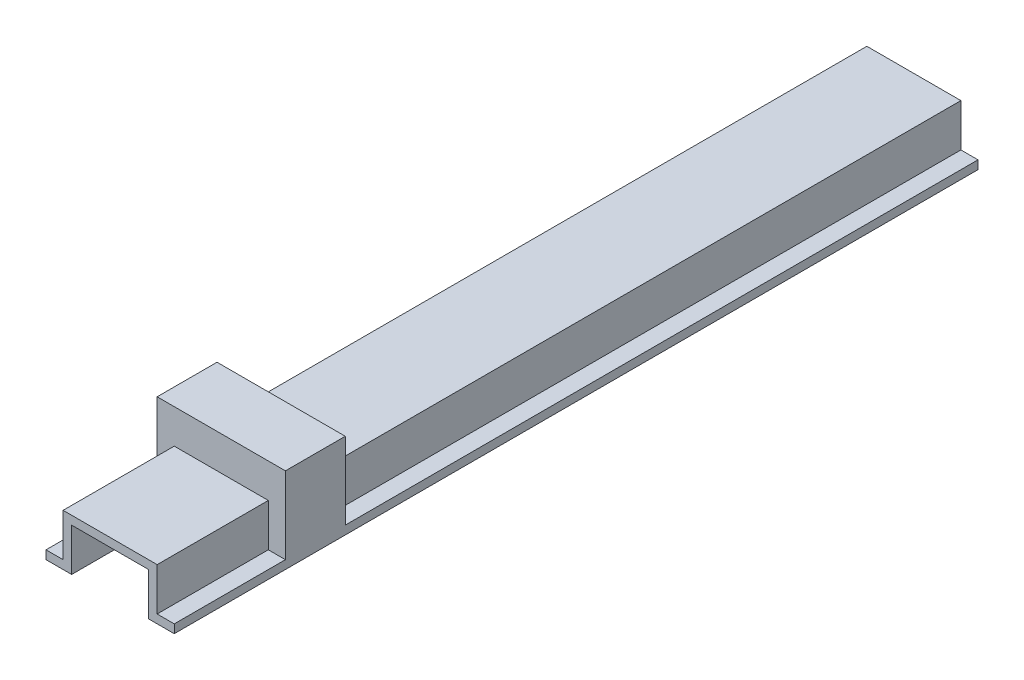
ISO-10303-21;
HEADER;
FILE_DESCRIPTION(('STEP AP214'),'2;1');
FILE_NAME('part.step','',(''),(''),'','','');
FILE_SCHEMA(('AUTOMOTIVE_DESIGN { 1 0 10303 214 1 1 1 1 }'));
ENDSEC;
DATA;
#1=APPLICATION_CONTEXT('core data for automotive mechanical design processes');
#2=APPLICATION_PROTOCOL_DEFINITION('international standard','automotive_design',2000,#1);
#3=PRODUCT_CONTEXT('',#1,'mechanical');
#4=PRODUCT('Part','Part','',(#3));
#5=PRODUCT_RELATED_PRODUCT_CATEGORY('part','',(#4));
#6=PRODUCT_DEFINITION_FORMATION('','',#4);
#7=PRODUCT_DEFINITION_CONTEXT('part definition',#1,'design');
#8=PRODUCT_DEFINITION('design','',#6,#7);
#9=PRODUCT_DEFINITION_SHAPE('','',#8);
#10=(LENGTH_UNIT() NAMED_UNIT(*) SI_UNIT(.MILLI.,.METRE.));
#11=(NAMED_UNIT(*) PLANE_ANGLE_UNIT() SI_UNIT($,.RADIAN.));
#12=(NAMED_UNIT(*) SI_UNIT($,.STERADIAN.) SOLID_ANGLE_UNIT());
#13=UNCERTAINTY_MEASURE_WITH_UNIT(LENGTH_MEASURE(1.E-05),#10,'distance_accuracy_value','');
#14=(GEOMETRIC_REPRESENTATION_CONTEXT(3) GLOBAL_UNCERTAINTY_ASSIGNED_CONTEXT((#13)) GLOBAL_UNIT_ASSIGNED_CONTEXT((#10,
#11,#12)) REPRESENTATION_CONTEXT('',''));
#15=CARTESIAN_POINT('',(0.,0.,0.));
#16=DIRECTION('',(0.,0.,1.));
#17=DIRECTION('',(1.,0.,0.));
#18=AXIS2_PLACEMENT_3D('',#15,#16,#17);
#19=CARTESIAN_POINT('',(-4.36598484476296,1.814,94.));
#20=DIRECTION('',(0.,1.,0.));
#21=DIRECTION('',(-1.,0.,0.));
#22=AXIS2_PLACEMENT_3D('',#19,#20,#21);
#23=PLANE('',#22);
#24=DIRECTION('',(0.,0.,-1.));
#25=VECTOR('',#24,1.);
#26=CARTESIAN_POINT('',(4.63401515523704,1.814,94.));
#27=LINE('',#26,#25);
#28=CARTESIAN_POINT('',(4.63401515523704,1.814,75.));
#29=VERTEX_POINT('',#28);
#30=CARTESIAN_POINT('',(4.63401515523704,1.814,0.));
#31=VERTEX_POINT('',#30);
#32=EDGE_CURVE('E320',#29,#31,#27,.T.);
#33=ORIENTED_EDGE('',*,*,#32,.F.);
#34=DIRECTION('',(-1.,0.,0.));
#35=VECTOR('',#34,1.);
#36=CARTESIAN_POINT('',(-4.36598484476296,1.814,75.));
#37=LINE('',#36,#35);
#38=CARTESIAN_POINT('',(-4.36598484476296,1.814,75.));
#39=VERTEX_POINT('',#38);
#40=EDGE_CURVE('E250',#29,#39,#37,.T.);
#41=ORIENTED_EDGE('',*,*,#40,.T.);
#42=DIRECTION('',(0.,0.,-1.));
#43=VECTOR('',#42,1.);
#44=CARTESIAN_POINT('',(-4.36598484476296,1.814,94.));
#45=LINE('',#44,#43);
#46=CARTESIAN_POINT('',(-4.36598484476296,1.814,0.));
#47=VERTEX_POINT('',#46);
#48=EDGE_CURVE('E353',#39,#47,#45,.T.);
#49=ORIENTED_EDGE('',*,*,#48,.T.);
#50=DIRECTION('',(1.,0.,0.));
#51=VECTOR('',#50,1.);
#52=CARTESIAN_POINT('',(-4.36598484476296,1.814,0.));
#53=LINE('',#52,#51);
#54=EDGE_CURVE('E348',#47,#31,#53,.T.);
#55=ORIENTED_EDGE('',*,*,#54,.T.);
#56=EDGE_LOOP('',(#33,#41,#49,#55));
#57=FACE_BOUND('',#56,.T.);
#58=ADVANCED_FACE('F33',(#57),#23,.F.);
#59=CARTESIAN_POINT('',(7.63401515523704,-2.186,94.));
#60=DIRECTION('',(0.,-1.,0.));
#61=DIRECTION('',(1.,0.,0.));
#62=AXIS2_PLACEMENT_3D('',#59,#60,#61);
#63=PLANE('',#62);
#64=DIRECTION('',(-1.,0.,0.));
#65=VECTOR('',#64,1.);
#66=CARTESIAN_POINT('',(-7.36598484476295,-2.186,74.));
#67=LINE('',#66,#65);
#68=CARTESIAN_POINT('',(7.63401515523705,-2.18599999999999,74.));
#69=VERTEX_POINT('',#68);
#70=CARTESIAN_POINT('',(5.63401515523704,-2.18599999999999,74.));
#71=VERTEX_POINT('',#70);
#72=EDGE_CURVE('E268',#69,#71,#67,.T.);
#73=ORIENTED_EDGE('',*,*,#72,.F.);
#74=DIRECTION('',(0.,0.,-1.));
#75=VECTOR('',#74,1.);
#76=CARTESIAN_POINT('',(7.63401515523704,-2.186,94.));
#77=LINE('',#76,#75);
#78=CARTESIAN_POINT('',(7.63401515523704,-2.186,0.));
#79=VERTEX_POINT('',#78);
#80=EDGE_CURVE('E383',#69,#79,#77,.T.);
#81=ORIENTED_EDGE('',*,*,#80,.T.);
#82=DIRECTION('',(-1.,0.,0.));
#83=VECTOR('',#82,1.);
#84=CARTESIAN_POINT('',(7.63401515523704,-2.186,0.));
#85=LINE('',#84,#83);
#86=CARTESIAN_POINT('',(5.63401515523704,-2.186,0.));
#87=VERTEX_POINT('',#86);
#88=EDGE_CURVE('E325',#79,#87,#85,.T.);
#89=ORIENTED_EDGE('',*,*,#88,.T.);
#90=DIRECTION('',(0.,0.,-1.));
#91=VECTOR('',#90,1.);
#92=CARTESIAN_POINT('',(5.63401515523704,-2.186,94.));
#93=LINE('',#92,#91);
#94=EDGE_CURVE('E379',#71,#87,#93,.T.);
#95=ORIENTED_EDGE('',*,*,#94,.F.);
#96=EDGE_LOOP('',(#73,#81,#89,#95));
#97=FACE_BOUND('',#96,.T.);
#98=ADVANCED_FACE('F405',(#97),#63,.F.);
#99=DIRECTION('',(1.,0.,0.));
#100=VECTOR('',#99,1.);
#101=CARTESIAN_POINT('',(-7.36598484476295,-2.186,81.));
#102=LINE('',#101,#100);
#103=CARTESIAN_POINT('',(5.63401515523704,-2.18599999999999,81.));
#104=VERTEX_POINT('',#103);
#105=CARTESIAN_POINT('',(7.63401515523704,-2.18599999999999,81.));
#106=VERTEX_POINT('',#105);
#107=EDGE_CURVE('E270',#104,#106,#102,.T.);
#108=ORIENTED_EDGE('',*,*,#107,.F.);
#109=CARTESIAN_POINT('',(5.63401515523704,-2.186,94.));
#110=VERTEX_POINT('',#109);
#111=EDGE_CURVE('E380',#110,#104,#93,.T.);
#112=ORIENTED_EDGE('',*,*,#111,.F.);
#113=DIRECTION('',(-1.,0.,0.));
#114=VECTOR('',#113,1.);
#115=CARTESIAN_POINT('',(7.63401515523704,-2.186,94.));
#116=LINE('',#115,#114);
#117=CARTESIAN_POINT('',(7.63401515523704,-2.186,94.));
#118=VERTEX_POINT('',#117);
#119=EDGE_CURVE('E301',#118,#110,#116,.T.);
#120=ORIENTED_EDGE('',*,*,#119,.F.);
#121=EDGE_CURVE('E384',#118,#106,#77,.T.);
#122=ORIENTED_EDGE('',*,*,#121,.T.);
#123=EDGE_LOOP('',(#108,#112,#120,#122));
#124=FACE_BOUND('',#123,.T.);
#125=ADVANCED_FACE('F424',(#124),#63,.F.);
#126=CARTESIAN_POINT('',(5.63401515523704,2.814,94.));
#127=DIRECTION('',(-1.,0.,0.));
#128=DIRECTION('',(0.,-1.,0.));
#129=AXIS2_PLACEMENT_3D('',#126,#127,#128);
#130=PLANE('',#129);
#131=DIRECTION('',(0.,1.,0.));
#132=VECTOR('',#131,1.);
#133=CARTESIAN_POINT('',(5.63401515523704,2.814,74.));
#134=LINE('',#133,#132);
#135=CARTESIAN_POINT('',(5.63401515523704,2.814,74.));
#136=VERTEX_POINT('',#135);
#137=EDGE_CURVE('E290',#71,#136,#134,.T.);
#138=ORIENTED_EDGE('',*,*,#137,.F.);
#139=ORIENTED_EDGE('',*,*,#94,.T.);
#140=DIRECTION('',(0.,1.,0.));
#141=VECTOR('',#140,1.);
#142=CARTESIAN_POINT('',(5.63401515523704,2.814,0.));
#143=LINE('',#142,#141);
#144=CARTESIAN_POINT('',(5.63401515523704,2.814,0.));
#145=VERTEX_POINT('',#144);
#146=EDGE_CURVE('E328',#87,#145,#143,.T.);
#147=ORIENTED_EDGE('',*,*,#146,.T.);
#148=DIRECTION('',(0.,0.,-1.));
#149=VECTOR('',#148,1.);
#150=CARTESIAN_POINT('',(5.63401515523704,2.814,94.));
#151=LINE('',#150,#149);
#152=EDGE_CURVE('E375',#136,#145,#151,.T.);
#153=ORIENTED_EDGE('',*,*,#152,.F.);
#154=EDGE_LOOP('',(#138,#139,#147,#153));
#155=FACE_BOUND('',#154,.T.);
#156=ADVANCED_FACE('F465',(#155),#130,.F.);
#157=DIRECTION('',(0.,-1.,0.));
#158=VECTOR('',#157,1.);
#159=CARTESIAN_POINT('',(5.63401515523704,2.814,81.));
#160=LINE('',#159,#158);
#161=CARTESIAN_POINT('',(5.63401515523704,2.814,81.));
#162=VERTEX_POINT('',#161);
#163=EDGE_CURVE('E284',#162,#104,#160,.T.);
#164=ORIENTED_EDGE('',*,*,#163,.F.);
#165=CARTESIAN_POINT('',(5.63401515523704,2.814,94.));
#166=VERTEX_POINT('',#165);
#167=EDGE_CURVE('E376',#166,#162,#151,.T.);
#168=ORIENTED_EDGE('',*,*,#167,.F.);
#169=DIRECTION('',(0.,1.,0.));
#170=VECTOR('',#169,1.);
#171=CARTESIAN_POINT('',(5.63401515523704,2.814,94.));
#172=LINE('',#171,#170);
#173=EDGE_CURVE('E303',#110,#166,#172,.T.);
#174=ORIENTED_EDGE('',*,*,#173,.F.);
#175=ORIENTED_EDGE('',*,*,#111,.T.);
#176=EDGE_LOOP('',(#164,#168,#174,#175));
#177=FACE_BOUND('',#176,.T.);
#178=ADVANCED_FACE('F467',(#177),#130,.F.);
#179=CARTESIAN_POINT('',(-5.36598484476296,2.814,94.));
#180=DIRECTION('',(0.,-1.,0.));
#181=DIRECTION('',(1.,0.,0.));
#182=AXIS2_PLACEMENT_3D('',#179,#180,#181);
#183=PLANE('',#182);
#184=DIRECTION('',(-1.,0.,0.));
#185=VECTOR('',#184,1.);
#186=CARTESIAN_POINT('',(-5.36598484476296,2.814,74.));
#187=LINE('',#186,#185);
#188=CARTESIAN_POINT('',(-5.36598484476296,2.814,74.));
#189=VERTEX_POINT('',#188);
#190=EDGE_CURVE('E288',#136,#189,#187,.T.);
#191=ORIENTED_EDGE('',*,*,#190,.F.);
#192=ORIENTED_EDGE('',*,*,#152,.T.);
#193=DIRECTION('',(-1.,0.,0.));
#194=VECTOR('',#193,1.);
#195=CARTESIAN_POINT('',(-5.36598484476296,2.814,0.));
#196=LINE('',#195,#194);
#197=CARTESIAN_POINT('',(-5.36598484476296,2.814,0.));
#198=VERTEX_POINT('',#197);
#199=EDGE_CURVE('E331',#145,#198,#196,.T.);
#200=ORIENTED_EDGE('',*,*,#199,.T.);
#201=DIRECTION('',(0.,0.,-1.));
#202=VECTOR('',#201,1.);
#203=CARTESIAN_POINT('',(-5.36598484476296,2.814,94.));
#204=LINE('',#203,#202);
#205=EDGE_CURVE('E371',#189,#198,#204,.T.);
#206=ORIENTED_EDGE('',*,*,#205,.F.);
#207=EDGE_LOOP('',(#191,#192,#200,#206));
#208=FACE_BOUND('',#207,.T.);
#209=ADVANCED_FACE('F462',(#208),#183,.F.);
#210=DIRECTION('',(1.,0.,0.));
#211=VECTOR('',#210,1.);
#212=CARTESIAN_POINT('',(-5.36598484476296,2.814,81.));
#213=LINE('',#212,#211);
#214=CARTESIAN_POINT('',(-5.36598484476296,2.814,81.));
#215=VERTEX_POINT('',#214);
#216=EDGE_CURVE('E282',#215,#162,#213,.T.);
#217=ORIENTED_EDGE('',*,*,#216,.F.);
#218=CARTESIAN_POINT('',(-5.36598484476296,2.814,94.));
#219=VERTEX_POINT('',#218);
#220=EDGE_CURVE('E372',#219,#215,#204,.T.);
#221=ORIENTED_EDGE('',*,*,#220,.F.);
#222=DIRECTION('',(-1.,0.,0.));
#223=VECTOR('',#222,1.);
#224=CARTESIAN_POINT('',(-5.36598484476296,2.814,94.));
#225=LINE('',#224,#223);
#226=EDGE_CURVE('E305',#166,#219,#225,.T.);
#227=ORIENTED_EDGE('',*,*,#226,.F.);
#228=ORIENTED_EDGE('',*,*,#167,.T.);
#229=EDGE_LOOP('',(#217,#221,#227,#228));
#230=FACE_BOUND('',#229,.T.);
#231=ADVANCED_FACE('F509',(#230),#183,.F.);
#232=CARTESIAN_POINT('',(-5.36598484476296,2.814,94.));
#233=DIRECTION('',(1.,0.,0.));
#234=DIRECTION('',(0.,1.,0.));
#235=AXIS2_PLACEMENT_3D('',#232,#233,#234);
#236=PLANE('',#235);
#237=DIRECTION('',(0.,-1.,0.));
#238=VECTOR('',#237,1.);
#239=CARTESIAN_POINT('',(-5.36598484476296,2.814,74.));
#240=LINE('',#239,#238);
#241=CARTESIAN_POINT('',(-5.36598484476296,-2.186,74.));
#242=VERTEX_POINT('',#241);
#243=EDGE_CURVE('E286',#189,#242,#240,.T.);
#244=ORIENTED_EDGE('',*,*,#243,.F.);
#245=ORIENTED_EDGE('',*,*,#205,.T.);
#246=DIRECTION('',(0.,-1.,0.));
#247=VECTOR('',#246,1.);
#248=CARTESIAN_POINT('',(-5.36598484476296,2.814,0.));
#249=LINE('',#248,#247);
#250=CARTESIAN_POINT('',(-5.36598484476296,-2.186,0.));
#251=VERTEX_POINT('',#250);
#252=EDGE_CURVE('E334',#198,#251,#249,.T.);
#253=ORIENTED_EDGE('',*,*,#252,.T.);
#254=DIRECTION('',(0.,0.,-1.));
#255=VECTOR('',#254,1.);
#256=CARTESIAN_POINT('',(-5.36598484476296,-2.186,94.));
#257=LINE('',#256,#255);
#258=EDGE_CURVE('E367',#242,#251,#257,.T.);
#259=ORIENTED_EDGE('',*,*,#258,.F.);
#260=EDGE_LOOP('',(#244,#245,#253,#259));
#261=FACE_BOUND('',#260,.T.);
#262=ADVANCED_FACE('F458',(#261),#236,.F.);
#263=DIRECTION('',(0.,1.,0.));
#264=VECTOR('',#263,1.);
#265=CARTESIAN_POINT('',(-5.36598484476296,2.814,81.));
#266=LINE('',#265,#264);
#267=CARTESIAN_POINT('',(-5.36598484476296,-2.186,81.));
#268=VERTEX_POINT('',#267);
#269=EDGE_CURVE('E280',#268,#215,#266,.T.);
#270=ORIENTED_EDGE('',*,*,#269,.F.);
#271=CARTESIAN_POINT('',(-5.36598484476296,-2.186,94.));
#272=VERTEX_POINT('',#271);
#273=EDGE_CURVE('E368',#272,#268,#257,.T.);
#274=ORIENTED_EDGE('',*,*,#273,.F.);
#275=DIRECTION('',(0.,-1.,0.));
#276=VECTOR('',#275,1.);
#277=CARTESIAN_POINT('',(-5.36598484476296,2.814,94.));
#278=LINE('',#277,#276);
#279=EDGE_CURVE('E307',#219,#272,#278,.T.);
#280=ORIENTED_EDGE('',*,*,#279,.F.);
#281=ORIENTED_EDGE('',*,*,#220,.T.);
#282=EDGE_LOOP('',(#270,#274,#280,#281));
#283=FACE_BOUND('',#282,.T.);
#284=ADVANCED_FACE('F507',(#283),#236,.F.);
#285=CARTESIAN_POINT('',(-5.36598484476296,-2.186,94.));
#286=DIRECTION('',(0.,-1.,0.));
#287=DIRECTION('',(1.,0.,0.));
#288=AXIS2_PLACEMENT_3D('',#285,#286,#287);
#289=PLANE('',#288);
#290=CARTESIAN_POINT('',(-7.36598484476296,-2.186,74.));
#291=VERTEX_POINT('',#290);
#292=EDGE_CURVE('E256',#242,#291,#67,.T.);
#293=ORIENTED_EDGE('',*,*,#292,.F.);
#294=ORIENTED_EDGE('',*,*,#258,.T.);
#295=DIRECTION('',(-1.,0.,0.));
#296=VECTOR('',#295,1.);
#297=CARTESIAN_POINT('',(-5.36598484476296,-2.186,0.));
#298=LINE('',#297,#296);
#299=CARTESIAN_POINT('',(-7.36598484476296,-2.186,0.));
#300=VERTEX_POINT('',#299);
#301=EDGE_CURVE('E337',#251,#300,#298,.T.);
#302=ORIENTED_EDGE('',*,*,#301,.T.);
#303=DIRECTION('',(0.,0.,-1.));
#304=VECTOR('',#303,1.);
#305=CARTESIAN_POINT('',(-7.36598484476296,-2.186,94.));
#306=LINE('',#305,#304);
#307=EDGE_CURVE('E363',#291,#300,#306,.T.);
#308=ORIENTED_EDGE('',*,*,#307,.F.);
#309=EDGE_LOOP('',(#293,#294,#302,#308));
#310=FACE_BOUND('',#309,.T.);
#311=ADVANCED_FACE('F454',(#310),#289,.F.);
#312=CARTESIAN_POINT('',(-7.36598484476295,-2.186,81.));
#313=VERTEX_POINT('',#312);
#314=EDGE_CURVE('E261',#313,#268,#102,.T.);
#315=ORIENTED_EDGE('',*,*,#314,.F.);
#316=CARTESIAN_POINT('',(-7.36598484476296,-2.186,94.));
#317=VERTEX_POINT('',#316);
#318=EDGE_CURVE('E364',#317,#313,#306,.T.);
#319=ORIENTED_EDGE('',*,*,#318,.F.);
#320=DIRECTION('',(-1.,0.,0.));
#321=VECTOR('',#320,1.);
#322=CARTESIAN_POINT('',(-5.36598484476296,-2.186,94.));
#323=LINE('',#322,#321);
#324=EDGE_CURVE('E309',#272,#317,#323,.T.);
#325=ORIENTED_EDGE('',*,*,#324,.F.);
#326=ORIENTED_EDGE('',*,*,#273,.T.);
#327=EDGE_LOOP('',(#315,#319,#325,#326));
#328=FACE_BOUND('',#327,.T.);
#329=ADVANCED_FACE('F490',(#328),#289,.F.);
#330=CARTESIAN_POINT('',(-4.36598484476296,1.814,94.));
#331=DIRECTION('',(-1.,0.,0.));
#332=DIRECTION('',(0.,0.,1.));
#333=AXIS2_PLACEMENT_3D('',#330,#331,#332);
#334=PLANE('',#333);
#335=ORIENTED_EDGE('',*,*,#48,.F.);
#336=DIRECTION('',(0.,-1.,0.));
#337=VECTOR('',#336,1.);
#338=CARTESIAN_POINT('',(-4.36598484476296,1.814,75.));
#339=LINE('',#338,#337);
#340=CARTESIAN_POINT('',(-4.36598484476296,-1.186,75.));
#341=VERTEX_POINT('',#340);
#342=EDGE_CURVE('E253',#39,#341,#339,.T.);
#343=ORIENTED_EDGE('',*,*,#342,.T.);
#344=DIRECTION('',(0.,0.,1.));
#345=VECTOR('',#344,1.);
#346=CARTESIAN_POINT('',(-4.36598484476296,-1.186,94.));
#347=LINE('',#346,#345);
#348=CARTESIAN_POINT('',(-4.36598484476296,-1.186,80.));
#349=VERTEX_POINT('',#348);
#350=EDGE_CURVE('E240',#341,#349,#347,.T.);
#351=ORIENTED_EDGE('',*,*,#350,.T.);
#352=DIRECTION('',(0.,1.,0.));
#353=VECTOR('',#352,1.);
#354=CARTESIAN_POINT('',(-4.36598484476296,1.814,80.));
#355=LINE('',#354,#353);
#356=CARTESIAN_POINT('',(-4.36598484476296,1.814,80.));
#357=VERTEX_POINT('',#356);
#358=EDGE_CURVE('E247',#349,#357,#355,.T.);
#359=ORIENTED_EDGE('',*,*,#358,.T.);
#360=CARTESIAN_POINT('',(-4.36598484476296,1.814,94.));
#361=VERTEX_POINT('',#360);
#362=EDGE_CURVE('E354',#361,#357,#45,.T.);
#363=ORIENTED_EDGE('',*,*,#362,.F.);
#364=DIRECTION('',(0.,1.,0.));
#365=VECTOR('',#364,1.);
#366=CARTESIAN_POINT('',(-4.36598484476296,-2.186,94.));
#367=LINE('',#366,#365);
#368=CARTESIAN_POINT('',(-4.36598484476296,-3.186,94.));
#369=VERTEX_POINT('',#368);
#370=EDGE_CURVE('E315',#369,#361,#367,.T.);
#371=ORIENTED_EDGE('',*,*,#370,.F.);
#372=DIRECTION('',(0.,0.,-1.));
#373=VECTOR('',#372,1.);
#374=CARTESIAN_POINT('',(-4.36598484476296,-3.186,94.));
#375=LINE('',#374,#373);
#376=CARTESIAN_POINT('',(-4.36598484476296,-3.186,0.));
#377=VERTEX_POINT('',#376);
#378=EDGE_CURVE('E357',#369,#377,#375,.T.);
#379=ORIENTED_EDGE('',*,*,#378,.T.);
#380=DIRECTION('',(0.,1.,0.));
#381=VECTOR('',#380,1.);
#382=CARTESIAN_POINT('',(-4.36598484476296,1.814,0.));
#383=LINE('',#382,#381);
#384=EDGE_CURVE('E345',#377,#47,#383,.T.);
#385=ORIENTED_EDGE('',*,*,#384,.T.);
#386=EDGE_LOOP('',(#335,#343,#351,#359,#363,#371,#379,#385));
#387=FACE_BOUND('',#386,.T.);
#388=ADVANCED_FACE('F437',(#387),#334,.F.);
#389=ORIENTED_EDGE('',*,*,#362,.T.);
#390=DIRECTION('',(1.,0.,0.));
#391=VECTOR('',#390,1.);
#392=CARTESIAN_POINT('',(-4.36598484476296,1.814,80.));
#393=LINE('',#392,#391);
#394=CARTESIAN_POINT('',(4.63401515523704,1.814,80.));
#395=VERTEX_POINT('',#394);
#396=EDGE_CURVE('E245',#357,#395,#393,.T.);
#397=ORIENTED_EDGE('',*,*,#396,.T.);
#398=CARTESIAN_POINT('',(4.63401515523704,1.814,94.));
#399=VERTEX_POINT('',#398);
#400=EDGE_CURVE('E212',#399,#395,#27,.T.);
#401=ORIENTED_EDGE('',*,*,#400,.F.);
#402=DIRECTION('',(1.,0.,0.));
#403=VECTOR('',#402,1.);
#404=CARTESIAN_POINT('',(-4.36598484476296,1.814,94.));
#405=LINE('',#404,#403);
#406=EDGE_CURVE('E317',#361,#399,#405,.T.);
#407=ORIENTED_EDGE('',*,*,#406,.F.);
#408=EDGE_LOOP('',(#389,#397,#401,#407));
#409=FACE_BOUND('',#408,.T.);
#410=ADVANCED_FACE('F478',(#409),#23,.F.);
#411=CARTESIAN_POINT('',(4.63401515523704,1.814,94.));
#412=DIRECTION('',(1.,0.,0.));
#413=DIRECTION('',(0.,0.,-1.));
#414=AXIS2_PLACEMENT_3D('',#411,#412,#413);
#415=PLANE('',#414);
#416=ORIENTED_EDGE('',*,*,#400,.T.);
#417=DIRECTION('',(0.,1.,0.));
#418=VECTOR('',#417,1.);
#419=CARTESIAN_POINT('',(4.63401515523704,5.81400000000001,80.));
#420=LINE('',#419,#418);
#421=CARTESIAN_POINT('',(4.63401515523704,5.81400000000001,80.));
#422=VERTEX_POINT('',#421);
#423=EDGE_CURVE('E206',#395,#422,#420,.T.);
#424=ORIENTED_EDGE('',*,*,#423,.T.);
#425=DIRECTION('',(0.,0.,-1.));
#426=VECTOR('',#425,1.);
#427=CARTESIAN_POINT('',(4.63401515523704,5.81400000000001,75.));
#428=LINE('',#427,#426);
#429=CARTESIAN_POINT('',(4.63401515523704,5.81400000000001,75.));
#430=VERTEX_POINT('',#429);
#431=EDGE_CURVE('E210',#422,#430,#428,.T.);
#432=ORIENTED_EDGE('',*,*,#431,.T.);
#433=DIRECTION('',(0.,-1.,0.));
#434=VECTOR('',#433,1.);
#435=CARTESIAN_POINT('',(4.63401515523704,5.81400000000001,75.));
#436=LINE('',#435,#434);
#437=EDGE_CURVE('E48',#430,#29,#436,.T.);
#438=ORIENTED_EDGE('',*,*,#437,.T.);
#439=ORIENTED_EDGE('',*,*,#32,.T.);
#440=DIRECTION('',(0.,-1.,0.));
#441=VECTOR('',#440,1.);
#442=CARTESIAN_POINT('',(4.63401515523704,1.814,0.));
#443=LINE('',#442,#441);
#444=CARTESIAN_POINT('',(4.63401515523704,-3.186,0.));
#445=VERTEX_POINT('',#444);
#446=EDGE_CURVE('E297',#31,#445,#443,.T.);
#447=ORIENTED_EDGE('',*,*,#446,.T.);
#448=DIRECTION('',(0.,0.,-1.));
#449=VECTOR('',#448,1.);
#450=CARTESIAN_POINT('',(4.63401515523704,-3.186,94.));
#451=LINE('',#450,#449);
#452=CARTESIAN_POINT('',(4.63401515523704,-3.186,94.));
#453=VERTEX_POINT('',#452);
#454=EDGE_CURVE('E11',#453,#445,#451,.T.);
#455=ORIENTED_EDGE('',*,*,#454,.F.);
#456=DIRECTION('',(0.,-1.,0.));
#457=VECTOR('',#456,1.);
#458=CARTESIAN_POINT('',(4.63401515523704,-2.186,94.));
#459=LINE('',#458,#457);
#460=EDGE_CURVE('E293',#399,#453,#459,.T.);
#461=ORIENTED_EDGE('',*,*,#460,.F.);
#462=EDGE_LOOP('',(#416,#424,#432,#438,#439,#447,#455,#461));
#463=FACE_BOUND('',#462,.T.);
#464=ADVANCED_FACE('F208',(#463),#415,.F.);
#465=CARTESIAN_POINT('',(4.63401515523704,-3.186,94.));
#466=DIRECTION('',(0.,1.,0.));
#467=DIRECTION('',(0.,0.,1.));
#468=AXIS2_PLACEMENT_3D('',#465,#466,#467);
#469=PLANE('',#468);
#470=DIRECTION('',(1.,0.,0.));
#471=VECTOR('',#470,1.);
#472=CARTESIAN_POINT('',(4.63401515523704,-3.186,0.));
#473=LINE('',#472,#471);
#474=CARTESIAN_POINT('',(7.63401515523704,-3.186,0.));
#475=VERTEX_POINT('',#474);
#476=EDGE_CURVE('E292',#445,#475,#473,.T.);
#477=ORIENTED_EDGE('',*,*,#476,.T.);
#478=DIRECTION('',(0.,0.,-1.));
#479=VECTOR('',#478,1.);
#480=CARTESIAN_POINT('',(7.63401515523704,-3.186,94.));
#481=LINE('',#480,#479);
#482=CARTESIAN_POINT('',(7.63401515523704,-3.186,94.));
#483=VERTEX_POINT('',#482);
#484=EDGE_CURVE('E41',#483,#475,#481,.T.);
#485=ORIENTED_EDGE('',*,*,#484,.F.);
#486=DIRECTION('',(1.,0.,0.));
#487=VECTOR('',#486,1.);
#488=CARTESIAN_POINT('',(4.63401515523704,-3.186,94.));
#489=LINE('',#488,#487);
#490=EDGE_CURVE('E296',#453,#483,#489,.T.);
#491=ORIENTED_EDGE('',*,*,#490,.F.);
#492=ORIENTED_EDGE('',*,*,#454,.T.);
#493=EDGE_LOOP('',(#477,#485,#491,#492));
#494=FACE_BOUND('',#493,.T.);
#495=ADVANCED_FACE('F35',(#494),#469,.F.);
#496=CARTESIAN_POINT('',(7.63401515523704,-2.186,94.));
#497=DIRECTION('',(-1.,0.,0.));
#498=DIRECTION('',(0.,0.,1.));
#499=AXIS2_PLACEMENT_3D('',#496,#497,#498);
#500=PLANE('',#499);
#501=DIRECTION('',(0.,1.,0.));
#502=VECTOR('',#501,1.);
#503=CARTESIAN_POINT('',(7.63401515523704,-2.186,0.));
#504=LINE('',#503,#502);
#505=EDGE_CURVE('E322',#475,#79,#504,.T.);
#506=ORIENTED_EDGE('',*,*,#505,.T.);
#507=ORIENTED_EDGE('',*,*,#80,.F.);
#508=DIRECTION('',(0.,-1.,0.));
#509=VECTOR('',#508,1.);
#510=CARTESIAN_POINT('',(7.63401515523705,6.81400000000001,74.));
#511=LINE('',#510,#509);
#512=CARTESIAN_POINT('',(7.63401515523705,6.81400000000001,74.));
#513=VERTEX_POINT('',#512);
#514=EDGE_CURVE('E278',#513,#69,#511,.T.);
#515=ORIENTED_EDGE('',*,*,#514,.F.);
#516=DIRECTION('',(0.,0.,-1.));
#517=VECTOR('',#516,1.);
#518=CARTESIAN_POINT('',(7.63401515523705,6.81400000000001,74.));
#519=LINE('',#518,#517);
#520=CARTESIAN_POINT('',(7.63401515523704,6.81400000000001,81.));
#521=VERTEX_POINT('',#520);
#522=EDGE_CURVE('E257',#521,#513,#519,.T.);
#523=ORIENTED_EDGE('',*,*,#522,.F.);
#524=DIRECTION('',(0.,-1.,0.));
#525=VECTOR('',#524,1.);
#526=CARTESIAN_POINT('',(7.63401515523704,6.81400000000001,81.));
#527=LINE('',#526,#525);
#528=EDGE_CURVE('E267',#521,#106,#527,.T.);
#529=ORIENTED_EDGE('',*,*,#528,.T.);
#530=ORIENTED_EDGE('',*,*,#121,.F.);
#531=DIRECTION('',(0.,1.,0.));
#532=VECTOR('',#531,1.);
#533=CARTESIAN_POINT('',(7.63401515523704,-2.186,94.));
#534=LINE('',#533,#532);
#535=EDGE_CURVE('E299',#483,#118,#534,.T.);
#536=ORIENTED_EDGE('',*,*,#535,.F.);
#537=ORIENTED_EDGE('',*,*,#484,.T.);
#538=EDGE_LOOP('',(#506,#507,#515,#523,#529,#530,#536,#537));
#539=FACE_BOUND('',#538,.T.);
#540=ADVANCED_FACE('F391',(#539),#500,.F.);
#541=CARTESIAN_POINT('',(-7.36598484476296,-2.186,94.));
#542=DIRECTION('',(1.,0.,0.));
#543=DIRECTION('',(0.,1.,0.));
#544=AXIS2_PLACEMENT_3D('',#541,#542,#543);
#545=PLANE('',#544);
#546=DIRECTION('',(0.,0.,1.));
#547=VECTOR('',#546,1.);
#548=CARTESIAN_POINT('',(-7.36598484476296,-1.186,75.));
#549=LINE('',#548,#547);
#550=CARTESIAN_POINT('',(-7.36598484476296,-1.186,75.));
#551=VERTEX_POINT('',#550);
#552=CARTESIAN_POINT('',(-7.36598484476296,-1.186,80.));
#553=VERTEX_POINT('',#552);
#554=EDGE_CURVE('E234',#551,#553,#549,.T.);
#555=ORIENTED_EDGE('',*,*,#554,.F.);
#556=DIRECTION('',(0.,-1.,0.));
#557=VECTOR('',#556,1.);
#558=CARTESIAN_POINT('',(-7.36598484476297,5.814,75.));
#559=LINE('',#558,#557);
#560=CARTESIAN_POINT('',(-7.36598484476297,5.814,75.));
#561=VERTEX_POINT('',#560);
#562=EDGE_CURVE('E56',#561,#551,#559,.T.);
#563=ORIENTED_EDGE('',*,*,#562,.F.);
#564=DIRECTION('',(0.,0.,-1.));
#565=VECTOR('',#564,1.);
#566=CARTESIAN_POINT('',(-7.36598484476297,5.814,75.));
#567=LINE('',#566,#565);
#568=CARTESIAN_POINT('',(-7.36598484476297,5.814,80.));
#569=VERTEX_POINT('',#568);
#570=EDGE_CURVE('E238',#569,#561,#567,.T.);
#571=ORIENTED_EDGE('',*,*,#570,.F.);
#572=DIRECTION('',(0.,1.,0.));
#573=VECTOR('',#572,1.);
#574=CARTESIAN_POINT('',(-7.36598484476297,5.814,80.));
#575=LINE('',#574,#573);
#576=EDGE_CURVE('E220',#553,#569,#575,.T.);
#577=ORIENTED_EDGE('',*,*,#576,.F.);
#578=EDGE_LOOP('',(#555,#563,#571,#577));
#579=FACE_BOUND('',#578,.T.);
#580=DIRECTION('',(0.,-1.,0.));
#581=VECTOR('',#580,1.);
#582=CARTESIAN_POINT('',(-7.36598484476296,-2.186,0.));
#583=LINE('',#582,#581);
#584=CARTESIAN_POINT('',(-7.36598484476296,-3.186,0.));
#585=VERTEX_POINT('',#584);
#586=EDGE_CURVE('E340',#300,#585,#583,.T.);
#587=ORIENTED_EDGE('',*,*,#586,.T.);
#588=DIRECTION('',(0.,0.,-1.));
#589=VECTOR('',#588,1.);
#590=CARTESIAN_POINT('',(-7.36598484476296,-3.186,94.));
#591=LINE('',#590,#589);
#592=CARTESIAN_POINT('',(-7.36598484476296,-3.186,94.));
#593=VERTEX_POINT('',#592);
#594=EDGE_CURVE('E360',#593,#585,#591,.T.);
#595=ORIENTED_EDGE('',*,*,#594,.F.);
#596=DIRECTION('',(0.,-1.,0.));
#597=VECTOR('',#596,1.);
#598=CARTESIAN_POINT('',(-7.36598484476296,-2.186,94.));
#599=LINE('',#598,#597);
#600=EDGE_CURVE('E311',#317,#593,#599,.T.);
#601=ORIENTED_EDGE('',*,*,#600,.F.);
#602=ORIENTED_EDGE('',*,*,#318,.T.);
#603=DIRECTION('',(0.,-1.,0.));
#604=VECTOR('',#603,1.);
#605=CARTESIAN_POINT('',(-7.36598484476295,6.814,81.));
#606=LINE('',#605,#604);
#607=CARTESIAN_POINT('',(-7.36598484476295,6.814,81.));
#608=VERTEX_POINT('',#607);
#609=EDGE_CURVE('E274',#608,#313,#606,.T.);
#610=ORIENTED_EDGE('',*,*,#609,.F.);
#611=DIRECTION('',(0.,0.,1.));
#612=VECTOR('',#611,1.);
#613=CARTESIAN_POINT('',(-7.36598484476295,6.814,74.));
#614=LINE('',#613,#612);
#615=CARTESIAN_POINT('',(-7.36598484476295,6.814,74.));
#616=VERTEX_POINT('',#615);
#617=EDGE_CURVE('E263',#616,#608,#614,.T.);
#618=ORIENTED_EDGE('',*,*,#617,.F.);
#619=DIRECTION('',(0.,-1.,0.));
#620=VECTOR('',#619,1.);
#621=CARTESIAN_POINT('',(-7.36598484476295,6.814,74.));
#622=LINE('',#621,#620);
#623=EDGE_CURVE('E276',#616,#291,#622,.T.);
#624=ORIENTED_EDGE('',*,*,#623,.T.);
#625=ORIENTED_EDGE('',*,*,#307,.T.);
#626=EDGE_LOOP('',(#587,#595,#601,#602,#610,#618,#624,#625));
#627=FACE_BOUND('',#626,.T.);
#628=ADVANCED_FACE('F449',(#579,#627),#545,.F.);
#629=CARTESIAN_POINT('',(-4.36598484476296,-3.186,94.));
#630=DIRECTION('',(0.,1.,0.));
#631=DIRECTION('',(-1.,0.,0.));
#632=AXIS2_PLACEMENT_3D('',#629,#630,#631);
#633=PLANE('',#632);
#634=DIRECTION('',(1.,0.,0.));
#635=VECTOR('',#634,1.);
#636=CARTESIAN_POINT('',(-4.36598484476296,-3.186,0.));
#637=LINE('',#636,#635);
#638=EDGE_CURVE('E342',#585,#377,#637,.T.);
#639=ORIENTED_EDGE('',*,*,#638,.T.);
#640=ORIENTED_EDGE('',*,*,#378,.F.);
#641=DIRECTION('',(1.,0.,0.));
#642=VECTOR('',#641,1.);
#643=CARTESIAN_POINT('',(-4.36598484476296,-3.186,94.));
#644=LINE('',#643,#642);
#645=EDGE_CURVE('E313',#593,#369,#644,.T.);
#646=ORIENTED_EDGE('',*,*,#645,.F.);
#647=ORIENTED_EDGE('',*,*,#594,.T.);
#648=EDGE_LOOP('',(#639,#640,#646,#647));
#649=FACE_BOUND('',#648,.T.);
#650=ADVANCED_FACE('F443',(#649),#633,.F.);
#651=CARTESIAN_POINT('',(0.,0.,94.));
#652=DIRECTION('',(0.,0.,1.));
#653=DIRECTION('',(1.,0.,0.));
#654=AXIS2_PLACEMENT_3D('',#651,#652,#653);
#655=PLANE('',#654);
#656=ORIENTED_EDGE('',*,*,#460,.T.);
#657=ORIENTED_EDGE('',*,*,#490,.T.);
#658=ORIENTED_EDGE('',*,*,#535,.T.);
#659=ORIENTED_EDGE('',*,*,#119,.T.);
#660=ORIENTED_EDGE('',*,*,#173,.T.);
#661=ORIENTED_EDGE('',*,*,#226,.T.);
#662=ORIENTED_EDGE('',*,*,#279,.T.);
#663=ORIENTED_EDGE('',*,*,#324,.T.);
#664=ORIENTED_EDGE('',*,*,#600,.T.);
#665=ORIENTED_EDGE('',*,*,#645,.T.);
#666=ORIENTED_EDGE('',*,*,#370,.T.);
#667=ORIENTED_EDGE('',*,*,#406,.T.);
#668=EDGE_LOOP('',(#656,#657,#658,#659,#660,#661,#662,#663,#664,#665,#666,#667));
#669=FACE_BOUND('',#668,.T.);
#670=ADVANCED_FACE('F428',(#669),#655,.T.);
#671=CARTESIAN_POINT('',(0.,0.,0.));
#672=DIRECTION('',(0.,0.,1.));
#673=DIRECTION('',(1.,0.,0.));
#674=AXIS2_PLACEMENT_3D('',#671,#672,#673);
#675=PLANE('',#674);
#676=ORIENTED_EDGE('',*,*,#476,.F.);
#677=ORIENTED_EDGE('',*,*,#446,.F.);
#678=ORIENTED_EDGE('',*,*,#54,.F.);
#679=ORIENTED_EDGE('',*,*,#384,.F.);
#680=ORIENTED_EDGE('',*,*,#638,.F.);
#681=ORIENTED_EDGE('',*,*,#586,.F.);
#682=ORIENTED_EDGE('',*,*,#301,.F.);
#683=ORIENTED_EDGE('',*,*,#252,.F.);
#684=ORIENTED_EDGE('',*,*,#199,.F.);
#685=ORIENTED_EDGE('',*,*,#146,.F.);
#686=ORIENTED_EDGE('',*,*,#88,.F.);
#687=ORIENTED_EDGE('',*,*,#505,.F.);
#688=EDGE_LOOP('',(#676,#677,#678,#679,#680,#681,#682,#683,#684,#685,#686,#687));
#689=FACE_BOUND('',#688,.T.);
#690=ADVANCED_FACE('F398',(#689),#675,.F.);
#691=CARTESIAN_POINT('',(-7.36598484476295,6.814,74.));
#692=DIRECTION('',(0.,0.,1.));
#693=DIRECTION('',(1.,0.,0.));
#694=AXIS2_PLACEMENT_3D('',#691,#692,#693);
#695=PLANE('',#694);
#696=ORIENTED_EDGE('',*,*,#72,.T.);
#697=ORIENTED_EDGE('',*,*,#137,.T.);
#698=ORIENTED_EDGE('',*,*,#190,.T.);
#699=ORIENTED_EDGE('',*,*,#243,.T.);
#700=ORIENTED_EDGE('',*,*,#292,.T.);
#701=ORIENTED_EDGE('',*,*,#623,.F.);
#702=DIRECTION('',(-1.,0.,0.));
#703=VECTOR('',#702,1.);
#704=CARTESIAN_POINT('',(-7.36598484476295,6.814,74.));
#705=LINE('',#704,#703);
#706=EDGE_CURVE('E260',#513,#616,#705,.T.);
#707=ORIENTED_EDGE('',*,*,#706,.F.);
#708=ORIENTED_EDGE('',*,*,#514,.T.);
#709=EDGE_LOOP('',(#696,#697,#698,#699,#700,#701,#707,#708));
#710=FACE_BOUND('',#709,.T.);
#711=ADVANCED_FACE('F409',(#710),#695,.F.);
#712=CARTESIAN_POINT('',(-7.36598484476295,6.814,81.));
#713=DIRECTION('',(0.,0.,-1.));
#714=DIRECTION('',(-1.,0.,0.));
#715=AXIS2_PLACEMENT_3D('',#712,#713,#714);
#716=PLANE('',#715);
#717=ORIENTED_EDGE('',*,*,#216,.T.);
#718=ORIENTED_EDGE('',*,*,#163,.T.);
#719=ORIENTED_EDGE('',*,*,#107,.T.);
#720=ORIENTED_EDGE('',*,*,#528,.F.);
#721=DIRECTION('',(1.,0.,0.));
#722=VECTOR('',#721,1.);
#723=CARTESIAN_POINT('',(-7.36598484476295,6.814,81.));
#724=LINE('',#723,#722);
#725=EDGE_CURVE('E265',#608,#521,#724,.T.);
#726=ORIENTED_EDGE('',*,*,#725,.F.);
#727=ORIENTED_EDGE('',*,*,#609,.T.);
#728=ORIENTED_EDGE('',*,*,#314,.T.);
#729=ORIENTED_EDGE('',*,*,#269,.T.);
#730=EDGE_LOOP('',(#717,#718,#719,#720,#726,#727,#728,#729));
#731=FACE_BOUND('',#730,.T.);
#732=ADVANCED_FACE('F420',(#731),#716,.F.);
#733=CARTESIAN_POINT('',(0.,6.814,0.));
#734=DIRECTION('',(0.,1.,0.));
#735=DIRECTION('',(-1.,0.,0.));
#736=AXIS2_PLACEMENT_3D('',#733,#734,#735);
#737=PLANE('',#736);
#738=ORIENTED_EDGE('',*,*,#522,.T.);
#739=ORIENTED_EDGE('',*,*,#706,.T.);
#740=ORIENTED_EDGE('',*,*,#617,.T.);
#741=ORIENTED_EDGE('',*,*,#725,.T.);
#742=EDGE_LOOP('',(#738,#739,#740,#741));
#743=FACE_BOUND('',#742,.T.);
#744=ADVANCED_FACE('F415',(#743),#737,.T.);
#745=CARTESIAN_POINT('',(4.63401515523704,5.81400000000001,75.));
#746=DIRECTION('',(0.,0.,-1.));
#747=DIRECTION('',(-1.,0.,0.));
#748=AXIS2_PLACEMENT_3D('',#745,#746,#747);
#749=PLANE('',#748);
#750=ORIENTED_EDGE('',*,*,#40,.F.);
#751=ORIENTED_EDGE('',*,*,#437,.F.);
#752=DIRECTION('',(-1.,0.,0.));
#753=VECTOR('',#752,1.);
#754=CARTESIAN_POINT('',(4.63401515523704,5.81400000000001,75.));
#755=LINE('',#754,#753);
#756=EDGE_CURVE('E224',#430,#561,#755,.T.);
#757=ORIENTED_EDGE('',*,*,#756,.T.);
#758=ORIENTED_EDGE('',*,*,#562,.T.);
#759=DIRECTION('',(-1.,0.,0.));
#760=VECTOR('',#759,1.);
#761=CARTESIAN_POINT('',(4.63401515523704,-1.18599999999999,75.));
#762=LINE('',#761,#760);
#763=EDGE_CURVE('E228',#341,#551,#762,.T.);
#764=ORIENTED_EDGE('',*,*,#763,.F.);
#765=ORIENTED_EDGE('',*,*,#342,.F.);
#766=EDGE_LOOP('',(#750,#751,#757,#758,#764,#765));
#767=FACE_BOUND('',#766,.T.);
#768=ADVANCED_FACE('F571',(#767),#749,.F.);
#769=CARTESIAN_POINT('',(4.63401515523704,5.81400000000001,80.));
#770=DIRECTION('',(0.,0.,1.));
#771=DIRECTION('',(1.,0.,0.));
#772=AXIS2_PLACEMENT_3D('',#769,#770,#771);
#773=PLANE('',#772);
#774=DIRECTION('',(-1.,0.,0.));
#775=VECTOR('',#774,1.);
#776=CARTESIAN_POINT('',(4.63401515523704,-1.18599999999999,80.));
#777=LINE('',#776,#775);
#778=EDGE_CURVE('E225',#349,#553,#777,.T.);
#779=ORIENTED_EDGE('',*,*,#778,.T.);
#780=ORIENTED_EDGE('',*,*,#576,.T.);
#781=DIRECTION('',(-1.,0.,0.));
#782=VECTOR('',#781,1.);
#783=CARTESIAN_POINT('',(4.63401515523704,5.81400000000001,80.));
#784=LINE('',#783,#782);
#785=EDGE_CURVE('E217',#422,#569,#784,.T.);
#786=ORIENTED_EDGE('',*,*,#785,.F.);
#787=ORIENTED_EDGE('',*,*,#423,.F.);
#788=ORIENTED_EDGE('',*,*,#396,.F.);
#789=ORIENTED_EDGE('',*,*,#358,.F.);
#790=EDGE_LOOP('',(#779,#780,#786,#787,#788,#789));
#791=FACE_BOUND('',#790,.T.);
#792=ADVANCED_FACE('F218',(#791),#773,.F.);
#793=CARTESIAN_POINT('',(4.63401515523704,-1.18599999999999,75.));
#794=DIRECTION('',(0.,-1.,0.));
#795=DIRECTION('',(1.,0.,0.));
#796=AXIS2_PLACEMENT_3D('',#793,#794,#795);
#797=PLANE('',#796);
#798=ORIENTED_EDGE('',*,*,#763,.T.);
#799=ORIENTED_EDGE('',*,*,#554,.T.);
#800=ORIENTED_EDGE('',*,*,#778,.F.);
#801=ORIENTED_EDGE('',*,*,#350,.F.);
#802=EDGE_LOOP('',(#798,#799,#800,#801));
#803=FACE_BOUND('',#802,.T.);
#804=ADVANCED_FACE('F494',(#803),#797,.F.);
#805=CARTESIAN_POINT('',(4.63401515523704,5.81400000000001,75.));
#806=DIRECTION('',(0.,1.,0.));
#807=DIRECTION('',(-1.,0.,0.));
#808=AXIS2_PLACEMENT_3D('',#805,#806,#807);
#809=PLANE('',#808);
#810=ORIENTED_EDGE('',*,*,#570,.T.);
#811=ORIENTED_EDGE('',*,*,#756,.F.);
#812=ORIENTED_EDGE('',*,*,#431,.F.);
#813=ORIENTED_EDGE('',*,*,#785,.T.);
#814=EDGE_LOOP('',(#810,#811,#812,#813));
#815=FACE_BOUND('',#814,.T.);
#816=ADVANCED_FACE('F227',(#815),#809,.F.);
#817=CLOSED_SHELL('',(#58,#98,#125,#156,#178,#209,#231,#262,#284,#311,#329,#388,#410,#464,#495,
#540,#628,#650,#670,#690,#711,#732,#744,#768,#792,#804,#816));
#818=MANIFOLD_SOLID_BREP('B2',#817);
#819=ADVANCED_BREP_SHAPE_REPRESENTATION('',(#18,#818),#14);
#820=SHAPE_DEFINITION_REPRESENTATION(#9,#819);
ENDSEC;
END-ISO-10303-21;
